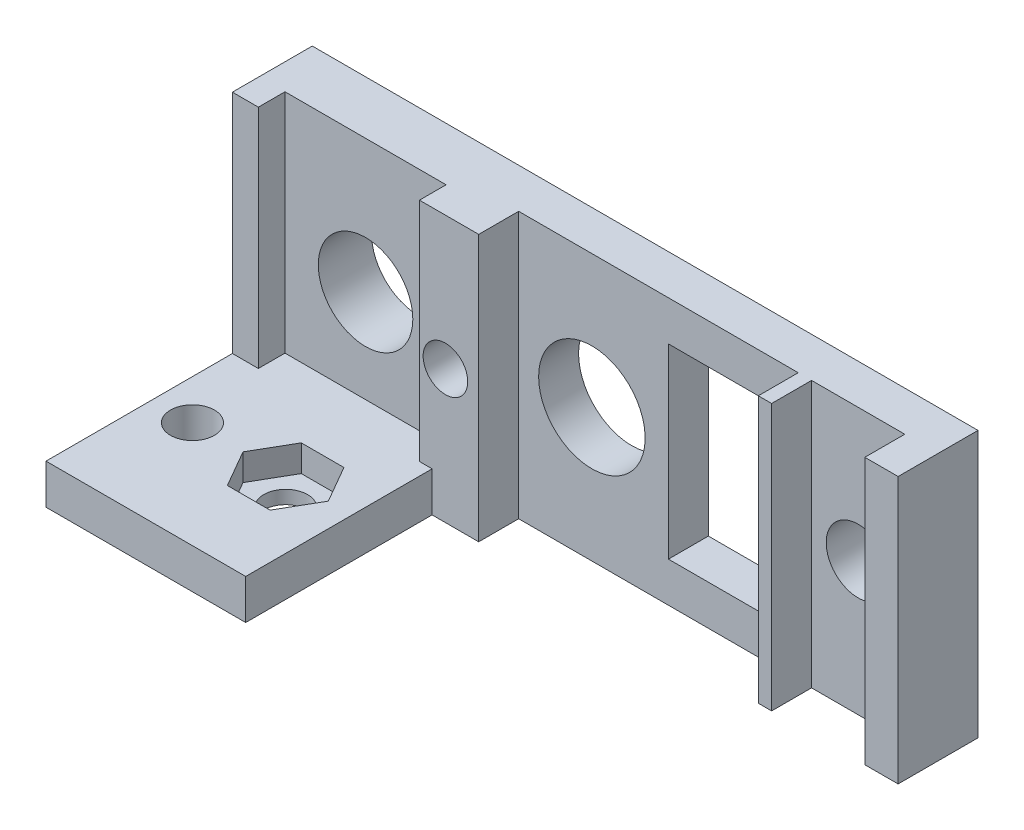
ISO-10303-21;
HEADER;
FILE_DESCRIPTION(('STEP AP214'),'2;1');
FILE_NAME('part.step','',(''),(''),'','','');
FILE_SCHEMA(('AUTOMOTIVE_DESIGN { 1 0 10303 214 1 1 1 1 }'));
ENDSEC;
DATA;
#1=APPLICATION_CONTEXT('core data for automotive mechanical design processes');
#2=APPLICATION_PROTOCOL_DEFINITION('international standard','automotive_design',2000,#1);
#3=PRODUCT_CONTEXT('',#1,'mechanical');
#4=PRODUCT('Part','Part','',(#3));
#5=PRODUCT_RELATED_PRODUCT_CATEGORY('part','',(#4));
#6=PRODUCT_DEFINITION_FORMATION('','',#4);
#7=PRODUCT_DEFINITION_CONTEXT('part definition',#1,'design');
#8=PRODUCT_DEFINITION('design','',#6,#7);
#9=PRODUCT_DEFINITION_SHAPE('','',#8);
#10=(LENGTH_UNIT() NAMED_UNIT(*) SI_UNIT(.MILLI.,.METRE.));
#11=(NAMED_UNIT(*) PLANE_ANGLE_UNIT() SI_UNIT($,.RADIAN.));
#12=(NAMED_UNIT(*) SI_UNIT($,.STERADIAN.) SOLID_ANGLE_UNIT());
#13=UNCERTAINTY_MEASURE_WITH_UNIT(LENGTH_MEASURE(1.E-05),#10,'distance_accuracy_value','');
#14=(GEOMETRIC_REPRESENTATION_CONTEXT(3) GLOBAL_UNCERTAINTY_ASSIGNED_CONTEXT((#13)) GLOBAL_UNIT_ASSIGNED_CONTEXT((#10,
#11,#12)) REPRESENTATION_CONTEXT('',''));
#15=CARTESIAN_POINT('',(0.,0.,0.));
#16=DIRECTION('',(0.,0.,1.));
#17=DIRECTION('',(1.,0.,0.));
#18=AXIS2_PLACEMENT_3D('',#15,#16,#17);
#19=CARTESIAN_POINT('',(0.,0.,6.));
#20=DIRECTION('',(0.,0.,1.));
#21=DIRECTION('',(1.,0.,0.));
#22=AXIS2_PLACEMENT_3D('',#19,#20,#21);
#23=PLANE('',#22);
#24=DIRECTION('',(0.,-1.,0.));
#25=VECTOR('',#24,1.);
#26=CARTESIAN_POINT('',(15.5,10.,6.));
#27=LINE('',#26,#25);
#28=CARTESIAN_POINT('',(15.5,10.,6.));
#29=VERTEX_POINT('',#28);
#30=CARTESIAN_POINT('',(15.5,-10.,6.));
#31=VERTEX_POINT('',#30);
#32=EDGE_CURVE('E244',#29,#31,#27,.T.);
#33=ORIENTED_EDGE('',*,*,#32,.F.);
#34=DIRECTION('',(-1.,0.,0.));
#35=VECTOR('',#34,1.);
#36=CARTESIAN_POINT('',(25.,10.,6.));
#37=LINE('',#36,#35);
#38=CARTESIAN_POINT('',(14.5,10.,6.));
#39=VERTEX_POINT('',#38);
#40=EDGE_CURVE('E548',#29,#39,#37,.T.);
#41=ORIENTED_EDGE('',*,*,#40,.T.);
#42=DIRECTION('',(0.,1.,0.));
#43=VECTOR('',#42,1.);
#44=CARTESIAN_POINT('',(14.5,-10.,6.));
#45=LINE('',#44,#43);
#46=CARTESIAN_POINT('',(14.5,-10.,6.));
#47=VERTEX_POINT('',#46);
#48=EDGE_CURVE('E452',#47,#39,#45,.T.);
#49=ORIENTED_EDGE('',*,*,#48,.F.);
#50=DIRECTION('',(1.,0.,0.));
#51=VECTOR('',#50,1.);
#52=CARTESIAN_POINT('',(25.,-10.,6.));
#53=LINE('',#52,#51);
#54=EDGE_CURVE('E539',#47,#31,#53,.T.);
#55=ORIENTED_EDGE('',*,*,#54,.T.);
#56=EDGE_LOOP('',(#33,#41,#49,#55));
#57=FACE_BOUND('',#56,.T.);
#58=ADVANCED_FACE('F45',(#57),#23,.T.);
#59=CARTESIAN_POINT('',(19.,0.,6.));
#60=DIRECTION('',(0.,0.,-1.));
#61=DIRECTION('',(-1.,0.,0.));
#62=AXIS2_PLACEMENT_3D('',#59,#60,#61);
#63=CYLINDRICAL_SURFACE('',#62,2.4);
#64=CARTESIAN_POINT('',(19.,0.,0.));
#65=DIRECTION('',(0.,0.,1.));
#66=DIRECTION('',(1.,0.,0.));
#67=AXIS2_PLACEMENT_3D('',#64,#65,#66);
#68=CIRCLE('',#67,2.4);
#69=CARTESIAN_POINT('',(21.4,0.,0.));
#70=VERTEX_POINT('',#69);
#71=EDGE_CURVE('E480',#70,#70,#68,.T.);
#72=ORIENTED_EDGE('',*,*,#71,.F.);
#73=EDGE_LOOP('',(#72));
#74=FACE_BOUND('',#73,.T.);
#75=CARTESIAN_POINT('',(19.,0.,3.));
#76=DIRECTION('',(0.,0.,1.));
#77=DIRECTION('',(1.,0.,0.));
#78=AXIS2_PLACEMENT_3D('',#75,#76,#77);
#79=CIRCLE('',#78,2.4);
#80=CARTESIAN_POINT('',(21.4,0.,3.));
#81=VERTEX_POINT('',#80);
#82=EDGE_CURVE('E49',#81,#81,#79,.T.);
#83=ORIENTED_EDGE('',*,*,#82,.T.);
#84=EDGE_LOOP('',(#83));
#85=FACE_BOUND('',#84,.T.);
#86=ADVANCED_FACE('F588',(#74,#85),#63,.F.);
#87=CARTESIAN_POINT('',(-15.,-10.,12.));
#88=DIRECTION('',(0.,1.,0.));
#89=DIRECTION('',(-1.,0.,0.));
#90=AXIS2_PLACEMENT_3D('',#87,#88,#89);
#91=CYLINDRICAL_SURFACE('',#90,1.65);
#92=CARTESIAN_POINT('',(-15.,-10.,12.));
#93=DIRECTION('',(0.,1.,0.));
#94=DIRECTION('',(-1.,0.,0.));
#95=AXIS2_PLACEMENT_3D('',#92,#93,#94);
#96=CIRCLE('',#95,1.65);
#97=CARTESIAN_POINT('',(-16.65,-10.,12.));
#98=VERTEX_POINT('',#97);
#99=EDGE_CURVE('E375',#98,#98,#96,.T.);
#100=ORIENTED_EDGE('',*,*,#99,.F.);
#101=EDGE_LOOP('',(#100));
#102=FACE_BOUND('',#101,.T.);
#103=CARTESIAN_POINT('',(-15.,-9.,12.));
#104=DIRECTION('',(0.,1.,0.));
#105=DIRECTION('',(0.,0.,1.));
#106=AXIS2_PLACEMENT_3D('',#103,#104,#105);
#107=CIRCLE('',#106,1.65);
#108=CARTESIAN_POINT('',(-15.,-9.,13.65));
#109=VERTEX_POINT('',#108);
#110=EDGE_CURVE('E351',#109,#109,#107,.F.);
#111=ORIENTED_EDGE('',*,*,#110,.F.);
#112=EDGE_LOOP('',(#111));
#113=FACE_BOUND('',#112,.T.);
#114=ADVANCED_FACE('F585',(#102,#113),#91,.F.);
#115=DIRECTION('',(0.,-1.,0.));
#116=VECTOR('',#115,1.);
#117=CARTESIAN_POINT('',(-6.5,9.99999999999999,6.));
#118=LINE('',#117,#116);
#119=CARTESIAN_POINT('',(-6.5,9.99999999999999,6.));
#120=VERTEX_POINT('',#119);
#121=CARTESIAN_POINT('',(-6.5,-10.,6.));
#122=VERTEX_POINT('',#121);
#123=EDGE_CURVE('E272',#120,#122,#118,.T.);
#124=ORIENTED_EDGE('',*,*,#123,.F.);
#125=CARTESIAN_POINT('',(-10.95,9.99999999999999,6.));
#126=VERTEX_POINT('',#125);
#127=EDGE_CURVE('E661',#120,#126,#37,.T.);
#128=ORIENTED_EDGE('',*,*,#127,.T.);
#129=DIRECTION('',(0.,1.,0.));
#130=VECTOR('',#129,1.);
#131=CARTESIAN_POINT('',(-10.95,-10.,6.));
#132=LINE('',#131,#130);
#133=CARTESIAN_POINT('',(-10.95,-7.,6.));
#134=VERTEX_POINT('',#133);
#135=EDGE_CURVE('E426',#134,#126,#132,.T.);
#136=ORIENTED_EDGE('',*,*,#135,.F.);
#137=DIRECTION('',(-1.,0.,0.));
#138=VECTOR('',#137,1.);
#139=CARTESIAN_POINT('',(0.,-7.,6.));
#140=LINE('',#139,#138);
#141=CARTESIAN_POINT('',(-10.,-7.,6.));
#142=VERTEX_POINT('',#141);
#143=EDGE_CURVE('E410',#142,#134,#140,.T.);
#144=ORIENTED_EDGE('',*,*,#143,.F.);
#145=DIRECTION('',(0.,-1.,0.));
#146=VECTOR('',#145,1.);
#147=CARTESIAN_POINT('',(-10.,0.,6.));
#148=LINE('',#147,#146);
#149=CARTESIAN_POINT('',(-10.,-10.,6.));
#150=VERTEX_POINT('',#149);
#151=EDGE_CURVE('E418',#142,#150,#148,.T.);
#152=ORIENTED_EDGE('',*,*,#151,.T.);
#153=EDGE_CURVE('E534',#150,#122,#53,.T.);
#154=ORIENTED_EDGE('',*,*,#153,.T.);
#155=EDGE_LOOP('',(#124,#128,#136,#144,#152,#154));
#156=FACE_BOUND('',#155,.T.);
#157=CARTESIAN_POINT('',(-9.,0.,6.));
#158=DIRECTION('',(0.,0.,1.));
#159=DIRECTION('',(1.,0.,0.));
#160=AXIS2_PLACEMENT_3D('',#157,#158,#159);
#161=CIRCLE('',#160,1.675);
#162=CARTESIAN_POINT('',(-7.325,0.,6.));
#163=VERTEX_POINT('',#162);
#164=EDGE_CURVE('E517',#163,#163,#161,.T.);
#165=ORIENTED_EDGE('',*,*,#164,.F.);
#166=EDGE_LOOP('',(#165));
#167=FACE_BOUND('',#166,.T.);
#168=ADVANCED_FACE('F587',(#156,#167),#23,.T.);
#169=DIRECTION('',(-1.,0.,0.));
#170=VECTOR('',#169,1.);
#171=CARTESIAN_POINT('',(0.,-7.,6.));
#172=LINE('',#171,#170);
#173=CARTESIAN_POINT('',(-23.05,-7.,6.));
#174=VERTEX_POINT('',#173);
#175=CARTESIAN_POINT('',(-25.,-7.,6.));
#176=VERTEX_POINT('',#175);
#177=EDGE_CURVE('E414',#174,#176,#172,.T.);
#178=ORIENTED_EDGE('',*,*,#177,.F.);
#179=DIRECTION('',(0.,-1.,0.));
#180=VECTOR('',#179,1.);
#181=CARTESIAN_POINT('',(-23.05,-10.,6.));
#182=LINE('',#181,#180);
#183=CARTESIAN_POINT('',(-23.05,9.99999999999999,6.));
#184=VERTEX_POINT('',#183);
#185=EDGE_CURVE('E421',#184,#174,#182,.T.);
#186=ORIENTED_EDGE('',*,*,#185,.F.);
#187=CARTESIAN_POINT('',(-25.,10.,6.));
#188=VERTEX_POINT('',#187);
#189=EDGE_CURVE('E542',#184,#188,#37,.T.);
#190=ORIENTED_EDGE('',*,*,#189,.T.);
#191=DIRECTION('',(0.,-1.,0.));
#192=VECTOR('',#191,1.);
#193=CARTESIAN_POINT('',(-25.,-10.,6.));
#194=LINE('',#193,#192);
#195=EDGE_CURVE('E529',#188,#176,#194,.T.);
#196=ORIENTED_EDGE('',*,*,#195,.T.);
#197=EDGE_LOOP('',(#178,#186,#190,#196));
#198=FACE_BOUND('',#197,.T.);
#199=ADVANCED_FACE('F596',(#198),#23,.T.);
#200=CARTESIAN_POINT('',(-17.,0.,6.));
#201=DIRECTION('',(0.,0.,-1.));
#202=DIRECTION('',(-1.,0.,0.));
#203=AXIS2_PLACEMENT_3D('',#200,#201,#202);
#204=CYLINDRICAL_SURFACE('',#203,3.55);
#205=CARTESIAN_POINT('',(-17.,0.,0.));
#206=DIRECTION('',(0.,0.,1.));
#207=DIRECTION('',(1.,0.,0.));
#208=AXIS2_PLACEMENT_3D('',#205,#206,#207);
#209=CIRCLE('',#208,3.55);
#210=CARTESIAN_POINT('',(-13.45,0.,0.));
#211=VERTEX_POINT('',#210);
#212=EDGE_CURVE('E521',#211,#211,#209,.T.);
#213=ORIENTED_EDGE('',*,*,#212,.F.);
#214=EDGE_LOOP('',(#213));
#215=FACE_BOUND('',#214,.T.);
#216=CARTESIAN_POINT('',(-17.,0.,4.));
#217=DIRECTION('',(0.,0.,1.));
#218=DIRECTION('',(1.,0.,0.));
#219=AXIS2_PLACEMENT_3D('',#216,#217,#218);
#220=CIRCLE('',#219,3.55);
#221=CARTESIAN_POINT('',(-13.45,0.,4.));
#222=VERTEX_POINT('',#221);
#223=EDGE_CURVE('E443',#222,#222,#220,.T.);
#224=ORIENTED_EDGE('',*,*,#223,.T.);
#225=EDGE_LOOP('',(#224));
#226=FACE_BOUND('',#225,.T.);
#227=ADVANCED_FACE('F628',(#215,#226),#204,.F.);
#228=CARTESIAN_POINT('',(13.25,-7.,6.));
#229=DIRECTION('',(-1.,0.,0.));
#230=DIRECTION('',(0.,0.,1.));
#231=AXIS2_PLACEMENT_3D('',#228,#229,#230);
#232=PLANE('',#231);
#233=DIRECTION('',(0.,0.,-1.));
#234=VECTOR('',#233,1.);
#235=CARTESIAN_POINT('',(13.25,-7.,6.));
#236=LINE('',#235,#234);
#237=CARTESIAN_POINT('',(13.25,-7.,3.));
#238=VERTEX_POINT('',#237);
#239=CARTESIAN_POINT('',(13.25,-7.,0.));
#240=VERTEX_POINT('',#239);
#241=EDGE_CURVE('E500',#238,#240,#236,.T.);
#242=ORIENTED_EDGE('',*,*,#241,.F.);
#243=DIRECTION('',(0.,1.,0.));
#244=VECTOR('',#243,1.);
#245=CARTESIAN_POINT('',(13.25,-7.,3.));
#246=LINE('',#245,#244);
#247=CARTESIAN_POINT('',(13.25,7.,3.));
#248=VERTEX_POINT('',#247);
#249=EDGE_CURVE('E476',#238,#248,#246,.T.);
#250=ORIENTED_EDGE('',*,*,#249,.T.);
#251=DIRECTION('',(0.,0.,-1.));
#252=VECTOR('',#251,1.);
#253=CARTESIAN_POINT('',(13.25,7.,6.));
#254=LINE('',#253,#252);
#255=CARTESIAN_POINT('',(13.25,7.,0.));
#256=VERTEX_POINT('',#255);
#257=EDGE_CURVE('E509',#248,#256,#254,.T.);
#258=ORIENTED_EDGE('',*,*,#257,.T.);
#259=DIRECTION('',(0.,1.,0.));
#260=VECTOR('',#259,1.);
#261=CARTESIAN_POINT('',(13.25,-7.,0.));
#262=LINE('',#261,#260);
#263=EDGE_CURVE('E484',#240,#256,#262,.T.);
#264=ORIENTED_EDGE('',*,*,#263,.F.);
#265=EDGE_LOOP('',(#242,#250,#258,#264));
#266=FACE_BOUND('',#265,.T.);
#267=ADVANCED_FACE('F633',(#266),#232,.T.);
#268=CARTESIAN_POINT('',(4.75,7.,6.));
#269=DIRECTION('',(0.,-1.,0.));
#270=DIRECTION('',(0.,0.,-1.));
#271=AXIS2_PLACEMENT_3D('',#268,#269,#270);
#272=PLANE('',#271);
#273=ORIENTED_EDGE('',*,*,#257,.F.);
#274=DIRECTION('',(-1.,0.,0.));
#275=VECTOR('',#274,1.);
#276=CARTESIAN_POINT('',(4.75,7.,3.));
#277=LINE('',#276,#275);
#278=CARTESIAN_POINT('',(4.75,7.,3.));
#279=VERTEX_POINT('',#278);
#280=EDGE_CURVE('E472',#248,#279,#277,.T.);
#281=ORIENTED_EDGE('',*,*,#280,.T.);
#282=DIRECTION('',(0.,0.,-1.));
#283=VECTOR('',#282,1.);
#284=CARTESIAN_POINT('',(4.75,7.,6.));
#285=LINE('',#284,#283);
#286=CARTESIAN_POINT('',(4.75,7.,0.));
#287=VERTEX_POINT('',#286);
#288=EDGE_CURVE('E506',#279,#287,#285,.T.);
#289=ORIENTED_EDGE('',*,*,#288,.T.);
#290=DIRECTION('',(-1.,0.,0.));
#291=VECTOR('',#290,1.);
#292=CARTESIAN_POINT('',(4.75,7.,0.));
#293=LINE('',#292,#291);
#294=EDGE_CURVE('E488',#256,#287,#293,.T.);
#295=ORIENTED_EDGE('',*,*,#294,.F.);
#296=EDGE_LOOP('',(#273,#281,#289,#295));
#297=FACE_BOUND('',#296,.T.);
#298=ADVANCED_FACE('F779',(#297),#272,.T.);
#299=CARTESIAN_POINT('',(4.75,-7.,6.));
#300=DIRECTION('',(1.,0.,0.));
#301=DIRECTION('',(0.,0.,-1.));
#302=AXIS2_PLACEMENT_3D('',#299,#300,#301);
#303=PLANE('',#302);
#304=ORIENTED_EDGE('',*,*,#288,.F.);
#305=DIRECTION('',(0.,-1.,0.));
#306=VECTOR('',#305,1.);
#307=CARTESIAN_POINT('',(4.75,-7.,3.));
#308=LINE('',#307,#306);
#309=CARTESIAN_POINT('',(4.75,-7.,3.));
#310=VERTEX_POINT('',#309);
#311=EDGE_CURVE('E466',#279,#310,#308,.T.);
#312=ORIENTED_EDGE('',*,*,#311,.T.);
#313=DIRECTION('',(0.,0.,-1.));
#314=VECTOR('',#313,1.);
#315=CARTESIAN_POINT('',(4.75,-7.,6.));
#316=LINE('',#315,#314);
#317=CARTESIAN_POINT('',(4.75,-7.,0.));
#318=VERTEX_POINT('',#317);
#319=EDGE_CURVE('E503',#310,#318,#316,.T.);
#320=ORIENTED_EDGE('',*,*,#319,.T.);
#321=DIRECTION('',(0.,-1.,0.));
#322=VECTOR('',#321,1.);
#323=CARTESIAN_POINT('',(4.75,-7.,0.));
#324=LINE('',#323,#322);
#325=EDGE_CURVE('E492',#287,#318,#324,.T.);
#326=ORIENTED_EDGE('',*,*,#325,.F.);
#327=EDGE_LOOP('',(#304,#312,#320,#326));
#328=FACE_BOUND('',#327,.T.);
#329=ADVANCED_FACE('F623',(#328),#303,.T.);
#330=CARTESIAN_POINT('',(4.75,-7.,6.));
#331=DIRECTION('',(0.,1.,0.));
#332=DIRECTION('',(0.,0.,1.));
#333=AXIS2_PLACEMENT_3D('',#330,#331,#332);
#334=PLANE('',#333);
#335=ORIENTED_EDGE('',*,*,#319,.F.);
#336=DIRECTION('',(1.,0.,0.));
#337=VECTOR('',#336,1.);
#338=CARTESIAN_POINT('',(4.75,-7.,3.));
#339=LINE('',#338,#337);
#340=EDGE_CURVE('E55',#310,#238,#339,.T.);
#341=ORIENTED_EDGE('',*,*,#340,.T.);
#342=ORIENTED_EDGE('',*,*,#241,.T.);
#343=DIRECTION('',(1.,0.,0.));
#344=VECTOR('',#343,1.);
#345=CARTESIAN_POINT('',(4.75,-7.,0.));
#346=LINE('',#345,#344);
#347=EDGE_CURVE('E496',#318,#240,#346,.T.);
#348=ORIENTED_EDGE('',*,*,#347,.F.);
#349=EDGE_LOOP('',(#335,#341,#342,#348));
#350=FACE_BOUND('',#349,.T.);
#351=ADVANCED_FACE('F615',(#350),#334,.T.);
#352=DIRECTION('',(0.,1.,0.));
#353=VECTOR('',#352,1.);
#354=CARTESIAN_POINT('',(22.5,10.,6.));
#355=LINE('',#354,#353);
#356=CARTESIAN_POINT('',(22.5,-10.,6.));
#357=VERTEX_POINT('',#356);
#358=CARTESIAN_POINT('',(22.5,10.,6.));
#359=VERTEX_POINT('',#358);
#360=EDGE_CURVE('E259',#357,#359,#355,.T.);
#361=ORIENTED_EDGE('',*,*,#360,.F.);
#362=CARTESIAN_POINT('',(25.,-10.,6.));
#363=VERTEX_POINT('',#362);
#364=EDGE_CURVE('E532',#357,#363,#53,.T.);
#365=ORIENTED_EDGE('',*,*,#364,.T.);
#366=DIRECTION('',(0.,1.,0.));
#367=VECTOR('',#366,1.);
#368=CARTESIAN_POINT('',(25.,-10.,6.));
#369=LINE('',#368,#367);
#370=CARTESIAN_POINT('',(25.,10.,6.));
#371=VERTEX_POINT('',#370);
#372=EDGE_CURVE('E538',#363,#371,#369,.T.);
#373=ORIENTED_EDGE('',*,*,#372,.T.);
#374=EDGE_CURVE('E543',#371,#359,#37,.T.);
#375=ORIENTED_EDGE('',*,*,#374,.T.);
#376=EDGE_LOOP('',(#361,#365,#373,#375));
#377=FACE_BOUND('',#376,.T.);
#378=ADVANCED_FACE('F607',(#377),#23,.T.);
#379=CARTESIAN_POINT('',(0.,0.,0.));
#380=DIRECTION('',(0.,0.,1.));
#381=DIRECTION('',(1.,0.,0.));
#382=AXIS2_PLACEMENT_3D('',#379,#380,#381);
#383=PLANE('',#382);
#384=DIRECTION('',(0.,1.,0.));
#385=VECTOR('',#384,1.);
#386=CARTESIAN_POINT('',(25.,-10.,0.));
#387=LINE('',#386,#385);
#388=CARTESIAN_POINT('',(25.,-10.,0.));
#389=VERTEX_POINT('',#388);
#390=CARTESIAN_POINT('',(25.,10.,0.));
#391=VERTEX_POINT('',#390);
#392=EDGE_CURVE('E554',#389,#391,#387,.T.);
#393=ORIENTED_EDGE('',*,*,#392,.F.);
#394=DIRECTION('',(1.,0.,0.));
#395=VECTOR('',#394,1.);
#396=CARTESIAN_POINT('',(25.,-10.,0.));
#397=LINE('',#396,#395);
#398=CARTESIAN_POINT('',(-25.,-10.,0.));
#399=VERTEX_POINT('',#398);
#400=EDGE_CURVE('E551',#399,#389,#397,.T.);
#401=ORIENTED_EDGE('',*,*,#400,.F.);
#402=DIRECTION('',(0.,-1.,0.));
#403=VECTOR('',#402,1.);
#404=CARTESIAN_POINT('',(-25.,-10.,0.));
#405=LINE('',#404,#403);
#406=CARTESIAN_POINT('',(-25.,10.,0.));
#407=VERTEX_POINT('',#406);
#408=EDGE_CURVE('E528',#407,#399,#405,.T.);
#409=ORIENTED_EDGE('',*,*,#408,.F.);
#410=DIRECTION('',(-1.,0.,0.));
#411=VECTOR('',#410,1.);
#412=CARTESIAN_POINT('',(25.,10.,0.));
#413=LINE('',#412,#411);
#414=EDGE_CURVE('E533',#391,#407,#413,.T.);
#415=ORIENTED_EDGE('',*,*,#414,.F.);
#416=EDGE_LOOP('',(#393,#401,#409,#415));
#417=FACE_BOUND('',#416,.T.);
#418=ORIENTED_EDGE('',*,*,#71,.T.);
#419=EDGE_LOOP('',(#418));
#420=FACE_BOUND('',#419,.T.);
#421=ORIENTED_EDGE('',*,*,#263,.T.);
#422=ORIENTED_EDGE('',*,*,#294,.T.);
#423=ORIENTED_EDGE('',*,*,#325,.T.);
#424=ORIENTED_EDGE('',*,*,#347,.T.);
#425=EDGE_LOOP('',(#421,#422,#423,#424));
#426=FACE_BOUND('',#425,.T.);
#427=ORIENTED_EDGE('',*,*,#212,.T.);
#428=EDGE_LOOP('',(#427));
#429=FACE_BOUND('',#428,.T.);
#430=CARTESIAN_POINT('',(-9.,0.,0.));
#431=DIRECTION('',(0.,0.,1.));
#432=DIRECTION('',(1.,0.,0.));
#433=AXIS2_PLACEMENT_3D('',#430,#431,#432);
#434=CIRCLE('',#433,1.675);
#435=CARTESIAN_POINT('',(-7.325,0.,0.));
#436=VERTEX_POINT('',#435);
#437=EDGE_CURVE('E516',#436,#436,#434,.T.);
#438=ORIENTED_EDGE('',*,*,#437,.T.);
#439=EDGE_LOOP('',(#438));
#440=FACE_BOUND('',#439,.T.);
#441=CARTESIAN_POINT('',(-1.,0.,0.));
#442=DIRECTION('',(0.,0.,1.));
#443=DIRECTION('',(1.,0.,0.));
#444=AXIS2_PLACEMENT_3D('',#441,#442,#443);
#445=CIRCLE('',#444,4.);
#446=CARTESIAN_POINT('',(3.,0.,0.));
#447=VERTEX_POINT('',#446);
#448=EDGE_CURVE('E512',#447,#447,#445,.T.);
#449=ORIENTED_EDGE('',*,*,#448,.T.);
#450=EDGE_LOOP('',(#449));
#451=FACE_BOUND('',#450,.T.);
#452=ADVANCED_FACE('F614',(#417,#420,#426,#429,#440,#451),#383,.F.);
#453=CARTESIAN_POINT('',(-25.,-10.,6.));
#454=DIRECTION('',(1.,0.,0.));
#455=DIRECTION('',(0.,0.,-1.));
#456=AXIS2_PLACEMENT_3D('',#453,#454,#455);
#457=PLANE('',#456);
#458=ORIENTED_EDGE('',*,*,#408,.T.);
#459=DIRECTION('',(0.,0.,-1.));
#460=VECTOR('',#459,1.);
#461=CARTESIAN_POINT('',(-25.,-10.,6.));
#462=LINE('',#461,#460);
#463=CARTESIAN_POINT('',(-25.,-10.,20.));
#464=VERTEX_POINT('',#463);
#465=EDGE_CURVE('E570',#464,#399,#462,.T.);
#466=ORIENTED_EDGE('',*,*,#465,.F.);
#467=DIRECTION('',(0.,1.,0.));
#468=VECTOR('',#467,1.);
#469=CARTESIAN_POINT('',(-25.,-10.,20.));
#470=LINE('',#469,#468);
#471=CARTESIAN_POINT('',(-25.,-7.,20.));
#472=VERTEX_POINT('',#471);
#473=EDGE_CURVE('E387',#464,#472,#470,.T.);
#474=ORIENTED_EDGE('',*,*,#473,.T.);
#475=DIRECTION('',(0.,0.,-1.));
#476=VECTOR('',#475,1.);
#477=CARTESIAN_POINT('',(-25.,-7.,0.));
#478=LINE('',#477,#476);
#479=EDGE_CURVE('E370',#472,#176,#478,.T.);
#480=ORIENTED_EDGE('',*,*,#479,.T.);
#481=ORIENTED_EDGE('',*,*,#195,.F.);
#482=DIRECTION('',(0.,0.,-1.));
#483=VECTOR('',#482,1.);
#484=CARTESIAN_POINT('',(-25.,10.,6.));
#485=LINE('',#484,#483);
#486=EDGE_CURVE('E547',#188,#407,#485,.T.);
#487=ORIENTED_EDGE('',*,*,#486,.T.);
#488=EDGE_LOOP('',(#458,#466,#474,#480,#481,#487));
#489=FACE_BOUND('',#488,.T.);
#490=ADVANCED_FACE('F47',(#489),#457,.F.);
#491=CARTESIAN_POINT('',(25.,-10.,6.));
#492=DIRECTION('',(0.,1.,0.));
#493=DIRECTION('',(-1.,0.,0.));
#494=AXIS2_PLACEMENT_3D('',#491,#492,#493);
#495=PLANE('',#494);
#496=CARTESIAN_POINT('',(-22.,-10.,12.));
#497=DIRECTION('',(0.,1.,0.));
#498=DIRECTION('',(-1.,0.,0.));
#499=AXIS2_PLACEMENT_3D('',#496,#497,#498);
#500=CIRCLE('',#499,1.65);
#501=CARTESIAN_POINT('',(-23.65,-10.,12.));
#502=VERTEX_POINT('',#501);
#503=EDGE_CURVE('E366',#502,#502,#500,.T.);
#504=ORIENTED_EDGE('',*,*,#503,.T.);
#505=EDGE_LOOP('',(#504));
#506=FACE_BOUND('',#505,.T.);
#507=ORIENTED_EDGE('',*,*,#99,.T.);
#508=EDGE_LOOP('',(#507));
#509=FACE_BOUND('',#508,.T.);
#510=DIRECTION('',(1.,0.,0.));
#511=VECTOR('',#510,1.);
#512=CARTESIAN_POINT('',(15.5,-10.,3.));
#513=LINE('',#512,#511);
#514=CARTESIAN_POINT('',(15.5,-10.,3.));
#515=VERTEX_POINT('',#514);
#516=CARTESIAN_POINT('',(22.5,-10.,3.));
#517=VERTEX_POINT('',#516);
#518=EDGE_CURVE('E254',#515,#517,#513,.T.);
#519=ORIENTED_EDGE('',*,*,#518,.F.);
#520=DIRECTION('',(0.,0.,1.));
#521=VECTOR('',#520,1.);
#522=CARTESIAN_POINT('',(15.5,-10.,3.));
#523=LINE('',#522,#521);
#524=EDGE_CURVE('E239',#515,#31,#523,.T.);
#525=ORIENTED_EDGE('',*,*,#524,.T.);
#526=ORIENTED_EDGE('',*,*,#54,.F.);
#527=DIRECTION('',(0.,0.,1.));
#528=VECTOR('',#527,1.);
#529=CARTESIAN_POINT('',(14.5,-10.,3.));
#530=LINE('',#529,#528);
#531=CARTESIAN_POINT('',(14.5,-10.,3.));
#532=VERTEX_POINT('',#531);
#533=EDGE_CURVE('E458',#532,#47,#530,.T.);
#534=ORIENTED_EDGE('',*,*,#533,.F.);
#535=DIRECTION('',(1.,0.,0.));
#536=VECTOR('',#535,1.);
#537=CARTESIAN_POINT('',(14.5,-10.,3.));
#538=LINE('',#537,#536);
#539=CARTESIAN_POINT('',(-6.5,-10.,3.));
#540=VERTEX_POINT('',#539);
#541=EDGE_CURVE('E447',#540,#532,#538,.T.);
#542=ORIENTED_EDGE('',*,*,#541,.F.);
#543=DIRECTION('',(0.,0.,1.));
#544=VECTOR('',#543,1.);
#545=CARTESIAN_POINT('',(-6.5,-10.,3.));
#546=LINE('',#545,#544);
#547=EDGE_CURVE('E289',#540,#122,#546,.T.);
#548=ORIENTED_EDGE('',*,*,#547,.T.);
#549=ORIENTED_EDGE('',*,*,#153,.F.);
#550=DIRECTION('',(0.,0.,1.));
#551=VECTOR('',#550,1.);
#552=CARTESIAN_POINT('',(-10.,-10.,0.));
#553=LINE('',#552,#551);
#554=CARTESIAN_POINT('',(-10.,-10.,20.));
#555=VERTEX_POINT('',#554);
#556=EDGE_CURVE('E379',#150,#555,#553,.T.);
#557=ORIENTED_EDGE('',*,*,#556,.T.);
#558=DIRECTION('',(-1.,0.,0.));
#559=VECTOR('',#558,1.);
#560=CARTESIAN_POINT('',(-25.,-10.,20.));
#561=LINE('',#560,#559);
#562=EDGE_CURVE('E382',#555,#464,#561,.T.);
#563=ORIENTED_EDGE('',*,*,#562,.T.);
#564=ORIENTED_EDGE('',*,*,#465,.T.);
#565=ORIENTED_EDGE('',*,*,#400,.T.);
#566=DIRECTION('',(0.,0.,-1.));
#567=VECTOR('',#566,1.);
#568=CARTESIAN_POINT('',(25.,-10.,6.));
#569=LINE('',#568,#567);
#570=EDGE_CURVE('E566',#363,#389,#569,.T.);
#571=ORIENTED_EDGE('',*,*,#570,.F.);
#572=ORIENTED_EDGE('',*,*,#364,.F.);
#573=DIRECTION('',(0.,0.,1.));
#574=VECTOR('',#573,1.);
#575=CARTESIAN_POINT('',(22.5,-10.,3.));
#576=LINE('',#575,#574);
#577=EDGE_CURVE('E250',#517,#357,#576,.T.);
#578=ORIENTED_EDGE('',*,*,#577,.F.);
#579=EDGE_LOOP('',(#519,#525,#526,#534,#542,#548,#549,#557,#563,#564,#565,#571,#572,#578));
#580=FACE_BOUND('',#579,.T.);
#581=ADVANCED_FACE('F261',(#506,#509,#580),#495,.F.);
#582=CARTESIAN_POINT('',(25.,-10.,6.));
#583=DIRECTION('',(-1.,0.,0.));
#584=DIRECTION('',(0.,0.,1.));
#585=AXIS2_PLACEMENT_3D('',#582,#583,#584);
#586=PLANE('',#585);
#587=ORIENTED_EDGE('',*,*,#392,.T.);
#588=DIRECTION('',(0.,0.,-1.));
#589=VECTOR('',#588,1.);
#590=CARTESIAN_POINT('',(25.,10.,6.));
#591=LINE('',#590,#589);
#592=EDGE_CURVE('E562',#371,#391,#591,.T.);
#593=ORIENTED_EDGE('',*,*,#592,.F.);
#594=ORIENTED_EDGE('',*,*,#372,.F.);
#595=ORIENTED_EDGE('',*,*,#570,.T.);
#596=EDGE_LOOP('',(#587,#593,#594,#595));
#597=FACE_BOUND('',#596,.T.);
#598=ADVANCED_FACE('F699',(#597),#586,.F.);
#599=CARTESIAN_POINT('',(25.,10.,6.));
#600=DIRECTION('',(0.,-1.,0.));
#601=DIRECTION('',(1.,0.,0.));
#602=AXIS2_PLACEMENT_3D('',#599,#600,#601);
#603=PLANE('',#602);
#604=ORIENTED_EDGE('',*,*,#40,.F.);
#605=DIRECTION('',(0.,0.,1.));
#606=VECTOR('',#605,1.);
#607=CARTESIAN_POINT('',(15.5,10.,3.));
#608=LINE('',#607,#606);
#609=CARTESIAN_POINT('',(15.5,10.,3.));
#610=VERTEX_POINT('',#609);
#611=EDGE_CURVE('E275',#610,#29,#608,.T.);
#612=ORIENTED_EDGE('',*,*,#611,.F.);
#613=DIRECTION('',(-1.,0.,0.));
#614=VECTOR('',#613,1.);
#615=CARTESIAN_POINT('',(15.5,10.,3.));
#616=LINE('',#615,#614);
#617=CARTESIAN_POINT('',(22.5,10.,3.));
#618=VERTEX_POINT('',#617);
#619=EDGE_CURVE('E251',#618,#610,#616,.T.);
#620=ORIENTED_EDGE('',*,*,#619,.F.);
#621=DIRECTION('',(0.,0.,1.));
#622=VECTOR('',#621,1.);
#623=CARTESIAN_POINT('',(22.5,10.,3.));
#624=LINE('',#623,#622);
#625=EDGE_CURVE('E279',#618,#359,#624,.T.);
#626=ORIENTED_EDGE('',*,*,#625,.T.);
#627=ORIENTED_EDGE('',*,*,#374,.F.);
#628=ORIENTED_EDGE('',*,*,#592,.T.);
#629=ORIENTED_EDGE('',*,*,#414,.T.);
#630=ORIENTED_EDGE('',*,*,#486,.F.);
#631=ORIENTED_EDGE('',*,*,#189,.F.);
#632=DIRECTION('',(0.,0.,1.));
#633=VECTOR('',#632,1.);
#634=CARTESIAN_POINT('',(-23.05,9.99999999999999,4.));
#635=LINE('',#634,#633);
#636=CARTESIAN_POINT('',(-23.05,9.99999999999999,4.));
#637=VERTEX_POINT('',#636);
#638=EDGE_CURVE('E440',#637,#184,#635,.T.);
#639=ORIENTED_EDGE('',*,*,#638,.F.);
#640=DIRECTION('',(-1.,0.,0.));
#641=VECTOR('',#640,1.);
#642=CARTESIAN_POINT('',(-10.95,9.99999999999999,4.));
#643=LINE('',#642,#641);
#644=CARTESIAN_POINT('',(-10.95,10.,4.));
#645=VERTEX_POINT('',#644);
#646=EDGE_CURVE('E429',#645,#637,#643,.T.);
#647=ORIENTED_EDGE('',*,*,#646,.F.);
#648=DIRECTION('',(0.,0.,1.));
#649=VECTOR('',#648,1.);
#650=CARTESIAN_POINT('',(-10.95,9.99999999999999,4.));
#651=LINE('',#650,#649);
#652=EDGE_CURVE('E433',#645,#126,#651,.T.);
#653=ORIENTED_EDGE('',*,*,#652,.T.);
#654=ORIENTED_EDGE('',*,*,#127,.F.);
#655=DIRECTION('',(0.,0.,1.));
#656=VECTOR('',#655,1.);
#657=CARTESIAN_POINT('',(-6.5,9.99999999999999,3.));
#658=LINE('',#657,#656);
#659=CARTESIAN_POINT('',(-6.5,9.99999999999999,3.));
#660=VERTEX_POINT('',#659);
#661=EDGE_CURVE('E285',#660,#120,#658,.T.);
#662=ORIENTED_EDGE('',*,*,#661,.F.);
#663=DIRECTION('',(-1.,0.,0.));
#664=VECTOR('',#663,1.);
#665=CARTESIAN_POINT('',(14.5,10.,3.));
#666=LINE('',#665,#664);
#667=CARTESIAN_POINT('',(14.5,10.,3.));
#668=VERTEX_POINT('',#667);
#669=EDGE_CURVE('E455',#668,#660,#666,.T.);
#670=ORIENTED_EDGE('',*,*,#669,.F.);
#671=DIRECTION('',(0.,0.,1.));
#672=VECTOR('',#671,1.);
#673=CARTESIAN_POINT('',(14.5,10.,3.));
#674=LINE('',#673,#672);
#675=EDGE_CURVE('E462',#668,#39,#674,.T.);
#676=ORIENTED_EDGE('',*,*,#675,.T.);
#677=EDGE_LOOP('',(#604,#612,#620,#626,#627,#628,#629,#630,#631,#639,#647,#653,#654,#662,#670,#676));
#678=FACE_BOUND('',#677,.T.);
#679=ADVANCED_FACE('F658',(#678),#603,.F.);
#680=CARTESIAN_POINT('',(-9.,0.,6.));
#681=DIRECTION('',(0.,0.,-1.));
#682=DIRECTION('',(-1.,0.,0.));
#683=AXIS2_PLACEMENT_3D('',#680,#681,#682);
#684=CYLINDRICAL_SURFACE('',#683,1.675);
#685=ORIENTED_EDGE('',*,*,#164,.T.);
#686=EDGE_LOOP('',(#685));
#687=FACE_BOUND('',#686,.T.);
#688=ORIENTED_EDGE('',*,*,#437,.F.);
#689=EDGE_LOOP('',(#688));
#690=FACE_BOUND('',#689,.T.);
#691=ADVANCED_FACE('F763',(#687,#690),#684,.F.);
#692=CARTESIAN_POINT('',(-1.,0.,6.));
#693=DIRECTION('',(0.,0.,-1.));
#694=DIRECTION('',(-1.,0.,0.));
#695=AXIS2_PLACEMENT_3D('',#692,#693,#694);
#696=CYLINDRICAL_SURFACE('',#695,4.);
#697=CARTESIAN_POINT('',(-1.,0.,3.));
#698=DIRECTION('',(0.,0.,-1.));
#699=DIRECTION('',(-1.,0.,0.));
#700=AXIS2_PLACEMENT_3D('',#697,#698,#699);
#701=CIRCLE('',#700,4.);
#702=CARTESIAN_POINT('',(-5.,0.,3.));
#703=VERTEX_POINT('',#702);
#704=EDGE_CURVE('E278',#703,#703,#701,.T.);
#705=ORIENTED_EDGE('',*,*,#704,.F.);
#706=EDGE_LOOP('',(#705));
#707=FACE_BOUND('',#706,.T.);
#708=ORIENTED_EDGE('',*,*,#448,.F.);
#709=EDGE_LOOP('',(#708));
#710=FACE_BOUND('',#709,.T.);
#711=ADVANCED_FACE('F768',(#707,#710),#696,.F.);
#712=CARTESIAN_POINT('',(14.5,-10.,3.));
#713=DIRECTION('',(1.,0.,0.));
#714=DIRECTION('',(0.,0.,-1.));
#715=AXIS2_PLACEMENT_3D('',#712,#713,#714);
#716=PLANE('',#715);
#717=ORIENTED_EDGE('',*,*,#48,.T.);
#718=ORIENTED_EDGE('',*,*,#675,.F.);
#719=DIRECTION('',(0.,1.,0.));
#720=VECTOR('',#719,1.);
#721=CARTESIAN_POINT('',(14.5,-10.,3.));
#722=LINE('',#721,#720);
#723=EDGE_CURVE('E451',#532,#668,#722,.T.);
#724=ORIENTED_EDGE('',*,*,#723,.F.);
#725=ORIENTED_EDGE('',*,*,#533,.T.);
#726=EDGE_LOOP('',(#717,#718,#724,#725));
#727=FACE_BOUND('',#726,.T.);
#728=ADVANCED_FACE('F668',(#727),#716,.F.);
#729=CARTESIAN_POINT('',(0.,0.,3.));
#730=DIRECTION('',(0.,0.,1.));
#731=DIRECTION('',(1.,0.,0.));
#732=AXIS2_PLACEMENT_3D('',#729,#730,#731);
#733=PLANE('',#732);
#734=ORIENTED_EDGE('',*,*,#340,.F.);
#735=ORIENTED_EDGE('',*,*,#311,.F.);
#736=ORIENTED_EDGE('',*,*,#280,.F.);
#737=ORIENTED_EDGE('',*,*,#249,.F.);
#738=EDGE_LOOP('',(#734,#735,#736,#737));
#739=FACE_BOUND('',#738,.T.);
#740=ORIENTED_EDGE('',*,*,#669,.T.);
#741=DIRECTION('',(0.,-1.,0.));
#742=VECTOR('',#741,1.);
#743=CARTESIAN_POINT('',(-6.5,9.99999999999999,3.));
#744=LINE('',#743,#742);
#745=EDGE_CURVE('E288',#660,#540,#744,.T.);
#746=ORIENTED_EDGE('',*,*,#745,.T.);
#747=ORIENTED_EDGE('',*,*,#541,.T.);
#748=ORIENTED_EDGE('',*,*,#723,.T.);
#749=EDGE_LOOP('',(#740,#746,#747,#748));
#750=FACE_BOUND('',#749,.T.);
#751=ORIENTED_EDGE('',*,*,#704,.T.);
#752=EDGE_LOOP('',(#751));
#753=FACE_BOUND('',#752,.T.);
#754=ADVANCED_FACE('F674',(#739,#750,#753),#733,.T.);
#755=CARTESIAN_POINT('',(-23.05,-10.,4.));
#756=DIRECTION('',(-1.,0.,0.));
#757=DIRECTION('',(0.,0.,1.));
#758=AXIS2_PLACEMENT_3D('',#755,#756,#757);
#759=PLANE('',#758);
#760=ORIENTED_EDGE('',*,*,#185,.T.);
#761=DIRECTION('',(0.,0.,-1.));
#762=VECTOR('',#761,1.);
#763=CARTESIAN_POINT('',(-23.05,-7.,4.));
#764=LINE('',#763,#762);
#765=CARTESIAN_POINT('',(-23.05,-7.,4.));
#766=VERTEX_POINT('',#765);
#767=EDGE_CURVE('E406',#174,#766,#764,.T.);
#768=ORIENTED_EDGE('',*,*,#767,.T.);
#769=DIRECTION('',(0.,-1.,0.));
#770=VECTOR('',#769,1.);
#771=CARTESIAN_POINT('',(-23.05,-10.,4.));
#772=LINE('',#771,#770);
#773=EDGE_CURVE('E422',#637,#766,#772,.T.);
#774=ORIENTED_EDGE('',*,*,#773,.F.);
#775=ORIENTED_EDGE('',*,*,#638,.T.);
#776=EDGE_LOOP('',(#760,#768,#774,#775));
#777=FACE_BOUND('',#776,.T.);
#778=ADVANCED_FACE('F642',(#777),#759,.F.);
#779=CARTESIAN_POINT('',(-10.95,-10.,4.));
#780=DIRECTION('',(1.,0.,0.));
#781=DIRECTION('',(0.,0.,-1.));
#782=AXIS2_PLACEMENT_3D('',#779,#780,#781);
#783=PLANE('',#782);
#784=DIRECTION('',(0.,1.,0.));
#785=VECTOR('',#784,1.);
#786=CARTESIAN_POINT('',(-10.95,-10.,4.));
#787=LINE('',#786,#785);
#788=CARTESIAN_POINT('',(-10.95,-7.,4.));
#789=VERTEX_POINT('',#788);
#790=EDGE_CURVE('E425',#789,#645,#787,.T.);
#791=ORIENTED_EDGE('',*,*,#790,.F.);
#792=DIRECTION('',(0.,0.,1.));
#793=VECTOR('',#792,1.);
#794=CARTESIAN_POINT('',(-10.95,-7.,4.));
#795=LINE('',#794,#793);
#796=EDGE_CURVE('E403',#789,#134,#795,.T.);
#797=ORIENTED_EDGE('',*,*,#796,.T.);
#798=ORIENTED_EDGE('',*,*,#135,.T.);
#799=ORIENTED_EDGE('',*,*,#652,.F.);
#800=EDGE_LOOP('',(#791,#797,#798,#799));
#801=FACE_BOUND('',#800,.T.);
#802=ADVANCED_FACE('F652',(#801),#783,.F.);
#803=CARTESIAN_POINT('',(0.,0.,4.));
#804=DIRECTION('',(0.,0.,1.));
#805=DIRECTION('',(1.,0.,0.));
#806=AXIS2_PLACEMENT_3D('',#803,#804,#805);
#807=PLANE('',#806);
#808=DIRECTION('',(-1.,0.,0.));
#809=VECTOR('',#808,1.);
#810=CARTESIAN_POINT('',(0.,-7.,4.));
#811=LINE('',#810,#809);
#812=EDGE_CURVE('E11',#789,#766,#811,.T.);
#813=ORIENTED_EDGE('',*,*,#812,.F.);
#814=ORIENTED_EDGE('',*,*,#790,.T.);
#815=ORIENTED_EDGE('',*,*,#646,.T.);
#816=ORIENTED_EDGE('',*,*,#773,.T.);
#817=EDGE_LOOP('',(#813,#814,#815,#816));
#818=FACE_BOUND('',#817,.T.);
#819=ORIENTED_EDGE('',*,*,#223,.F.);
#820=EDGE_LOOP('',(#819));
#821=FACE_BOUND('',#820,.T.);
#822=ADVANCED_FACE('F648',(#818,#821),#807,.T.);
#823=CARTESIAN_POINT('',(-10.,-10.,0.));
#824=DIRECTION('',(-1.,0.,0.));
#825=DIRECTION('',(0.,-1.,0.));
#826=AXIS2_PLACEMENT_3D('',#823,#824,#825);
#827=PLANE('',#826);
#828=ORIENTED_EDGE('',*,*,#151,.F.);
#829=DIRECTION('',(0.,0.,1.));
#830=VECTOR('',#829,1.);
#831=CARTESIAN_POINT('',(-10.,-7.,0.));
#832=LINE('',#831,#830);
#833=CARTESIAN_POINT('',(-10.,-7.,20.));
#834=VERTEX_POINT('',#833);
#835=EDGE_CURVE('E391',#142,#834,#832,.T.);
#836=ORIENTED_EDGE('',*,*,#835,.T.);
#837=DIRECTION('',(0.,1.,0.));
#838=VECTOR('',#837,1.);
#839=CARTESIAN_POINT('',(-10.,-10.,20.));
#840=LINE('',#839,#838);
#841=EDGE_CURVE('E399',#555,#834,#840,.T.);
#842=ORIENTED_EDGE('',*,*,#841,.F.);
#843=ORIENTED_EDGE('',*,*,#556,.F.);
#844=EDGE_LOOP('',(#828,#836,#842,#843));
#845=FACE_BOUND('',#844,.T.);
#846=ADVANCED_FACE('F685',(#845),#827,.F.);
#847=CARTESIAN_POINT('',(-25.,-10.,20.));
#848=DIRECTION('',(0.,0.,-1.));
#849=DIRECTION('',(-1.,0.,0.));
#850=AXIS2_PLACEMENT_3D('',#847,#848,#849);
#851=PLANE('',#850);
#852=DIRECTION('',(-1.,0.,0.));
#853=VECTOR('',#852,1.);
#854=CARTESIAN_POINT('',(-25.,-7.,20.));
#855=LINE('',#854,#853);
#856=EDGE_CURVE('E383',#834,#472,#855,.T.);
#857=ORIENTED_EDGE('',*,*,#856,.T.);
#858=ORIENTED_EDGE('',*,*,#473,.F.);
#859=ORIENTED_EDGE('',*,*,#562,.F.);
#860=ORIENTED_EDGE('',*,*,#841,.T.);
#861=EDGE_LOOP('',(#857,#858,#859,#860));
#862=FACE_BOUND('',#861,.T.);
#863=ADVANCED_FACE('F690',(#862),#851,.F.);
#864=CARTESIAN_POINT('',(0.,-7.,0.));
#865=DIRECTION('',(0.,1.,0.));
#866=DIRECTION('',(-1.,0.,0.));
#867=AXIS2_PLACEMENT_3D('',#864,#865,#866);
#868=PLANE('',#867);
#869=DIRECTION('',(-0.5,0.,-0.866025403784438));
#870=VECTOR('',#869,1.);
#871=CARTESIAN_POINT('',(-11.7957060059976,-7.,12.));
#872=LINE('',#871,#870);
#873=CARTESIAN_POINT('',(-11.7957060059976,-7.,12.));
#874=VERTEX_POINT('',#873);
#875=CARTESIAN_POINT('',(-13.3978530029988,-7.,9.225));
#876=VERTEX_POINT('',#875);
#877=EDGE_CURVE('E71',#874,#876,#872,.T.);
#878=ORIENTED_EDGE('',*,*,#877,.F.);
#879=DIRECTION('',(0.5,0.,-0.866025403784439));
#880=VECTOR('',#879,1.);
#881=CARTESIAN_POINT('',(-13.3978530029988,-7.,14.775));
#882=LINE('',#881,#880);
#883=CARTESIAN_POINT('',(-13.3978530029988,-7.,14.775));
#884=VERTEX_POINT('',#883);
#885=EDGE_CURVE('E306',#884,#874,#882,.T.);
#886=ORIENTED_EDGE('',*,*,#885,.F.);
#887=DIRECTION('',(1.,0.,0.));
#888=VECTOR('',#887,1.);
#889=CARTESIAN_POINT('',(-16.6021469970012,-7.,14.775));
#890=LINE('',#889,#888);
#891=CARTESIAN_POINT('',(-16.6021469970012,-7.,14.775));
#892=VERTEX_POINT('',#891);
#893=EDGE_CURVE('E341',#892,#884,#890,.T.);
#894=ORIENTED_EDGE('',*,*,#893,.F.);
#895=DIRECTION('',(0.5,0.,0.866025403784439));
#896=VECTOR('',#895,1.);
#897=CARTESIAN_POINT('',(-18.2042939940024,-7.,12.));
#898=LINE('',#897,#896);
#899=CARTESIAN_POINT('',(-18.2042939940024,-7.,12.));
#900=VERTEX_POINT('',#899);
#901=EDGE_CURVE('E337',#900,#892,#898,.T.);
#902=ORIENTED_EDGE('',*,*,#901,.F.);
#903=DIRECTION('',(-0.5,0.,0.866025403784439));
#904=VECTOR('',#903,1.);
#905=CARTESIAN_POINT('',(-16.6021469970012,-7.,9.225));
#906=LINE('',#905,#904);
#907=CARTESIAN_POINT('',(-16.6021469970012,-7.,9.225));
#908=VERTEX_POINT('',#907);
#909=EDGE_CURVE('E333',#908,#900,#906,.T.);
#910=ORIENTED_EDGE('',*,*,#909,.F.);
#911=DIRECTION('',(-1.,0.,0.));
#912=VECTOR('',#911,1.);
#913=CARTESIAN_POINT('',(-13.3978530029988,-7.,9.225));
#914=LINE('',#913,#912);
#915=EDGE_CURVE('E329',#876,#908,#914,.T.);
#916=ORIENTED_EDGE('',*,*,#915,.F.);
#917=EDGE_LOOP('',(#878,#886,#894,#902,#910,#916));
#918=FACE_BOUND('',#917,.T.);
#919=CARTESIAN_POINT('',(-22.,-7.,12.));
#920=DIRECTION('',(0.,1.,0.));
#921=DIRECTION('',(-1.,0.,0.));
#922=AXIS2_PLACEMENT_3D('',#919,#920,#921);
#923=CIRCLE('',#922,1.65);
#924=CARTESIAN_POINT('',(-23.65,-7.,12.));
#925=VERTEX_POINT('',#924);
#926=EDGE_CURVE('E371',#925,#925,#923,.T.);
#927=ORIENTED_EDGE('',*,*,#926,.F.);
#928=EDGE_LOOP('',(#927));
#929=FACE_BOUND('',#928,.T.);
#930=ORIENTED_EDGE('',*,*,#767,.F.);
#931=ORIENTED_EDGE('',*,*,#177,.T.);
#932=ORIENTED_EDGE('',*,*,#479,.F.);
#933=ORIENTED_EDGE('',*,*,#856,.F.);
#934=ORIENTED_EDGE('',*,*,#835,.F.);
#935=ORIENTED_EDGE('',*,*,#143,.T.);
#936=ORIENTED_EDGE('',*,*,#796,.F.);
#937=ORIENTED_EDGE('',*,*,#812,.T.);
#938=EDGE_LOOP('',(#930,#931,#932,#933,#934,#935,#936,#937));
#939=FACE_BOUND('',#938,.T.);
#940=ADVANCED_FACE('F644',(#918,#929,#939),#868,.T.);
#941=CARTESIAN_POINT('',(-22.,-10.,12.));
#942=DIRECTION('',(0.,1.,0.));
#943=DIRECTION('',(-1.,0.,0.));
#944=AXIS2_PLACEMENT_3D('',#941,#942,#943);
#945=CYLINDRICAL_SURFACE('',#944,1.65);
#946=ORIENTED_EDGE('',*,*,#503,.F.);
#947=EDGE_LOOP('',(#946));
#948=FACE_BOUND('',#947,.T.);
#949=ORIENTED_EDGE('',*,*,#926,.T.);
#950=EDGE_LOOP('',(#949));
#951=FACE_BOUND('',#950,.T.);
#952=ADVANCED_FACE('F724',(#948,#951),#945,.F.);
#953=CARTESIAN_POINT('',(0.,-9.,0.));
#954=DIRECTION('',(0.,1.,0.));
#955=DIRECTION('',(0.,0.,1.));
#956=AXIS2_PLACEMENT_3D('',#953,#954,#955);
#957=PLANE('',#956);
#958=DIRECTION('',(-0.5,0.,-0.866025403784438));
#959=VECTOR('',#958,1.);
#960=CARTESIAN_POINT('',(-11.7957060059976,-9.,12.));
#961=LINE('',#960,#959);
#962=CARTESIAN_POINT('',(-11.7957060059976,-9.,12.));
#963=VERTEX_POINT('',#962);
#964=CARTESIAN_POINT('',(-13.3978530029988,-9.,9.225));
#965=VERTEX_POINT('',#964);
#966=EDGE_CURVE('E301',#963,#965,#961,.T.);
#967=ORIENTED_EDGE('',*,*,#966,.T.);
#968=DIRECTION('',(-1.,0.,0.));
#969=VECTOR('',#968,1.);
#970=CARTESIAN_POINT('',(-13.3978530029988,-9.,9.225));
#971=LINE('',#970,#969);
#972=CARTESIAN_POINT('',(-16.6021469970012,-9.,9.225));
#973=VERTEX_POINT('',#972);
#974=EDGE_CURVE('E305',#965,#973,#971,.T.);
#975=ORIENTED_EDGE('',*,*,#974,.T.);
#976=DIRECTION('',(-0.5,0.,0.866025403784439));
#977=VECTOR('',#976,1.);
#978=CARTESIAN_POINT('',(-16.6021469970012,-9.,9.225));
#979=LINE('',#978,#977);
#980=CARTESIAN_POINT('',(-18.2042939940024,-9.,12.));
#981=VERTEX_POINT('',#980);
#982=EDGE_CURVE('E310',#973,#981,#979,.T.);
#983=ORIENTED_EDGE('',*,*,#982,.T.);
#984=DIRECTION('',(0.5,0.,0.866025403784439));
#985=VECTOR('',#984,1.);
#986=CARTESIAN_POINT('',(-18.2042939940024,-9.,12.));
#987=LINE('',#986,#985);
#988=CARTESIAN_POINT('',(-16.6021469970012,-9.,14.775));
#989=VERTEX_POINT('',#988);
#990=EDGE_CURVE('E314',#981,#989,#987,.T.);
#991=ORIENTED_EDGE('',*,*,#990,.T.);
#992=DIRECTION('',(1.,0.,0.));
#993=VECTOR('',#992,1.);
#994=CARTESIAN_POINT('',(-16.6021469970012,-9.,14.775));
#995=LINE('',#994,#993);
#996=CARTESIAN_POINT('',(-13.3978530029988,-9.,14.775));
#997=VERTEX_POINT('',#996);
#998=EDGE_CURVE('E318',#989,#997,#995,.T.);
#999=ORIENTED_EDGE('',*,*,#998,.T.);
#1000=DIRECTION('',(0.5,0.,-0.866025403784439));
#1001=VECTOR('',#1000,1.);
#1002=CARTESIAN_POINT('',(-13.3978530029988,-9.,14.775));
#1003=LINE('',#1002,#1001);
#1004=EDGE_CURVE('E322',#997,#963,#1003,.T.);
#1005=ORIENTED_EDGE('',*,*,#1004,.T.);
#1006=EDGE_LOOP('',(#967,#975,#983,#991,#999,#1005));
#1007=FACE_BOUND('',#1006,.T.);
#1008=ORIENTED_EDGE('',*,*,#110,.T.);
#1009=EDGE_LOOP('',(#1008));
#1010=FACE_BOUND('',#1009,.T.);
#1011=ADVANCED_FACE('F583',(#1007,#1010),#957,.T.);
#1012=CARTESIAN_POINT('',(-11.7957060059976,-9.,12.));
#1013=DIRECTION('',(0.866025403784439,0.,-0.5));
#1014=DIRECTION('',(-0.5,0.,-0.866025403784438));
#1015=AXIS2_PLACEMENT_3D('',#1012,#1013,#1014);
#1016=PLANE('',#1015);
#1017=ORIENTED_EDGE('',*,*,#877,.T.);
#1018=DIRECTION('',(0.,1.,0.));
#1019=VECTOR('',#1018,1.);
#1020=CARTESIAN_POINT('',(-13.3978530029988,-9.,9.225));
#1021=LINE('',#1020,#1019);
#1022=EDGE_CURVE('E326',#965,#876,#1021,.T.);
#1023=ORIENTED_EDGE('',*,*,#1022,.F.);
#1024=ORIENTED_EDGE('',*,*,#966,.F.);
#1025=DIRECTION('',(0.,1.,0.));
#1026=VECTOR('',#1025,1.);
#1027=CARTESIAN_POINT('',(-11.7957060059976,-9.,12.));
#1028=LINE('',#1027,#1026);
#1029=EDGE_CURVE('E348',#963,#874,#1028,.T.);
#1030=ORIENTED_EDGE('',*,*,#1029,.T.);
#1031=EDGE_LOOP('',(#1017,#1023,#1024,#1030));
#1032=FACE_BOUND('',#1031,.T.);
#1033=ADVANCED_FACE('F723',(#1032),#1016,.F.);
#1034=CARTESIAN_POINT('',(-13.3978530029988,-9.,14.775));
#1035=DIRECTION('',(0.866025403784439,0.,0.5));
#1036=DIRECTION('',(0.5,0.,-0.866025403784439));
#1037=AXIS2_PLACEMENT_3D('',#1034,#1035,#1036);
#1038=PLANE('',#1037);
#1039=ORIENTED_EDGE('',*,*,#885,.T.);
#1040=ORIENTED_EDGE('',*,*,#1029,.F.);
#1041=ORIENTED_EDGE('',*,*,#1004,.F.);
#1042=DIRECTION('',(0.,1.,0.));
#1043=VECTOR('',#1042,1.);
#1044=CARTESIAN_POINT('',(-13.3978530029988,-9.,14.775));
#1045=LINE('',#1044,#1043);
#1046=EDGE_CURVE('E352',#997,#884,#1045,.T.);
#1047=ORIENTED_EDGE('',*,*,#1046,.T.);
#1048=EDGE_LOOP('',(#1039,#1040,#1041,#1047));
#1049=FACE_BOUND('',#1048,.T.);
#1050=ADVANCED_FACE('F726',(#1049),#1038,.F.);
#1051=CARTESIAN_POINT('',(-16.6021469970012,-9.,14.775));
#1052=DIRECTION('',(0.,0.,1.));
#1053=DIRECTION('',(1.,0.,0.));
#1054=AXIS2_PLACEMENT_3D('',#1051,#1052,#1053);
#1055=PLANE('',#1054);
#1056=ORIENTED_EDGE('',*,*,#893,.T.);
#1057=ORIENTED_EDGE('',*,*,#1046,.F.);
#1058=ORIENTED_EDGE('',*,*,#998,.F.);
#1059=DIRECTION('',(0.,1.,0.));
#1060=VECTOR('',#1059,1.);
#1061=CARTESIAN_POINT('',(-16.6021469970012,-9.,14.775));
#1062=LINE('',#1061,#1060);
#1063=EDGE_CURVE('E355',#989,#892,#1062,.T.);
#1064=ORIENTED_EDGE('',*,*,#1063,.T.);
#1065=EDGE_LOOP('',(#1056,#1057,#1058,#1064));
#1066=FACE_BOUND('',#1065,.T.);
#1067=ADVANCED_FACE('F729',(#1066),#1055,.F.);
#1068=CARTESIAN_POINT('',(-18.2042939940024,-9.,12.));
#1069=DIRECTION('',(-0.866025403784439,0.,0.5));
#1070=DIRECTION('',(0.5,0.,0.866025403784439));
#1071=AXIS2_PLACEMENT_3D('',#1068,#1069,#1070);
#1072=PLANE('',#1071);
#1073=ORIENTED_EDGE('',*,*,#901,.T.);
#1074=ORIENTED_EDGE('',*,*,#1063,.F.);
#1075=ORIENTED_EDGE('',*,*,#990,.F.);
#1076=DIRECTION('',(0.,1.,0.));
#1077=VECTOR('',#1076,1.);
#1078=CARTESIAN_POINT('',(-18.2042939940024,-9.,12.));
#1079=LINE('',#1078,#1077);
#1080=EDGE_CURVE('E358',#981,#900,#1079,.T.);
#1081=ORIENTED_EDGE('',*,*,#1080,.T.);
#1082=EDGE_LOOP('',(#1073,#1074,#1075,#1081));
#1083=FACE_BOUND('',#1082,.T.);
#1084=ADVANCED_FACE('F733',(#1083),#1072,.F.);
#1085=CARTESIAN_POINT('',(-16.6021469970012,-9.,9.225));
#1086=DIRECTION('',(-0.866025403784439,0.,-0.5));
#1087=DIRECTION('',(-0.5,0.,0.866025403784439));
#1088=AXIS2_PLACEMENT_3D('',#1085,#1086,#1087);
#1089=PLANE('',#1088);
#1090=ORIENTED_EDGE('',*,*,#909,.T.);
#1091=ORIENTED_EDGE('',*,*,#1080,.F.);
#1092=ORIENTED_EDGE('',*,*,#982,.F.);
#1093=DIRECTION('',(0.,1.,0.));
#1094=VECTOR('',#1093,1.);
#1095=CARTESIAN_POINT('',(-16.6021469970012,-9.,9.225));
#1096=LINE('',#1095,#1094);
#1097=EDGE_CURVE('E361',#973,#908,#1096,.T.);
#1098=ORIENTED_EDGE('',*,*,#1097,.T.);
#1099=EDGE_LOOP('',(#1090,#1091,#1092,#1098));
#1100=FACE_BOUND('',#1099,.T.);
#1101=ADVANCED_FACE('F737',(#1100),#1089,.F.);
#1102=CARTESIAN_POINT('',(-13.3978530029988,-9.,9.225));
#1103=DIRECTION('',(0.,0.,-1.));
#1104=DIRECTION('',(-1.,0.,0.));
#1105=AXIS2_PLACEMENT_3D('',#1102,#1103,#1104);
#1106=PLANE('',#1105);
#1107=ORIENTED_EDGE('',*,*,#915,.T.);
#1108=ORIENTED_EDGE('',*,*,#1097,.F.);
#1109=ORIENTED_EDGE('',*,*,#974,.F.);
#1110=ORIENTED_EDGE('',*,*,#1022,.T.);
#1111=EDGE_LOOP('',(#1107,#1108,#1109,#1110));
#1112=FACE_BOUND('',#1111,.T.);
#1113=ADVANCED_FACE('F720',(#1112),#1106,.F.);
#1114=CARTESIAN_POINT('',(-6.5,9.99999999999999,3.));
#1115=DIRECTION('',(-1.,0.,0.));
#1116=DIRECTION('',(0.,-1.,0.));
#1117=AXIS2_PLACEMENT_3D('',#1114,#1115,#1116);
#1118=PLANE('',#1117);
#1119=ORIENTED_EDGE('',*,*,#123,.T.);
#1120=ORIENTED_EDGE('',*,*,#547,.F.);
#1121=ORIENTED_EDGE('',*,*,#745,.F.);
#1122=ORIENTED_EDGE('',*,*,#661,.T.);
#1123=EDGE_LOOP('',(#1119,#1120,#1121,#1122));
#1124=FACE_BOUND('',#1123,.T.);
#1125=ADVANCED_FACE('F678',(#1124),#1118,.F.);
#1126=CARTESIAN_POINT('',(15.5,10.,3.));
#1127=DIRECTION('',(-1.,0.,0.));
#1128=DIRECTION('',(0.,-1.,0.));
#1129=AXIS2_PLACEMENT_3D('',#1126,#1127,#1128);
#1130=PLANE('',#1129);
#1131=ORIENTED_EDGE('',*,*,#32,.T.);
#1132=ORIENTED_EDGE('',*,*,#524,.F.);
#1133=DIRECTION('',(0.,-1.,0.));
#1134=VECTOR('',#1133,1.);
#1135=CARTESIAN_POINT('',(15.5,10.,3.));
#1136=LINE('',#1135,#1134);
#1137=EDGE_CURVE('E242',#610,#515,#1136,.T.);
#1138=ORIENTED_EDGE('',*,*,#1137,.F.);
#1139=ORIENTED_EDGE('',*,*,#611,.T.);
#1140=EDGE_LOOP('',(#1131,#1132,#1138,#1139));
#1141=FACE_BOUND('',#1140,.T.);
#1142=ADVANCED_FACE('F241',(#1141),#1130,.F.);
#1143=CARTESIAN_POINT('',(22.5,10.,3.));
#1144=DIRECTION('',(1.,0.,0.));
#1145=DIRECTION('',(0.,1.,0.));
#1146=AXIS2_PLACEMENT_3D('',#1143,#1144,#1145);
#1147=PLANE('',#1146);
#1148=ORIENTED_EDGE('',*,*,#360,.T.);
#1149=ORIENTED_EDGE('',*,*,#625,.F.);
#1150=DIRECTION('',(0.,1.,0.));
#1151=VECTOR('',#1150,1.);
#1152=CARTESIAN_POINT('',(22.5,10.,3.));
#1153=LINE('',#1152,#1151);
#1154=EDGE_CURVE('E63',#517,#618,#1153,.T.);
#1155=ORIENTED_EDGE('',*,*,#1154,.F.);
#1156=ORIENTED_EDGE('',*,*,#577,.T.);
#1157=EDGE_LOOP('',(#1148,#1149,#1155,#1156));
#1158=FACE_BOUND('',#1157,.T.);
#1159=ADVANCED_FACE('F707',(#1158),#1147,.F.);
#1160=CARTESIAN_POINT('',(0.,0.,3.));
#1161=DIRECTION('',(0.,0.,1.));
#1162=DIRECTION('',(1.,0.,0.));
#1163=AXIS2_PLACEMENT_3D('',#1160,#1161,#1162);
#1164=PLANE('',#1163);
#1165=ORIENTED_EDGE('',*,*,#82,.F.);
#1166=EDGE_LOOP('',(#1165));
#1167=FACE_BOUND('',#1166,.T.);
#1168=ORIENTED_EDGE('',*,*,#1137,.T.);
#1169=ORIENTED_EDGE('',*,*,#518,.T.);
#1170=ORIENTED_EDGE('',*,*,#1154,.T.);
#1171=ORIENTED_EDGE('',*,*,#619,.T.);
#1172=EDGE_LOOP('',(#1168,#1169,#1170,#1171));
#1173=FACE_BOUND('',#1172,.T.);
#1174=ADVANCED_FACE('F253',(#1167,#1173),#1164,.T.);
#1175=CLOSED_SHELL('',(#58,#86,#114,#168,#199,#227,#267,#298,#329,#351,#378,#452,#490,#581,#598,
#679,#691,#711,#728,#754,#778,#802,#822,#846,#863,#940,#952,#1011,#1033,#1050,#1067,#1084,#1101,
#1113,#1125,#1142,#1159,#1174));
#1176=MANIFOLD_SOLID_BREP('B2',#1175);
#1177=ADVANCED_BREP_SHAPE_REPRESENTATION('',(#18,#1176),#14);
#1178=SHAPE_DEFINITION_REPRESENTATION(#9,#1177);
ENDSEC;
END-ISO-10303-21;
